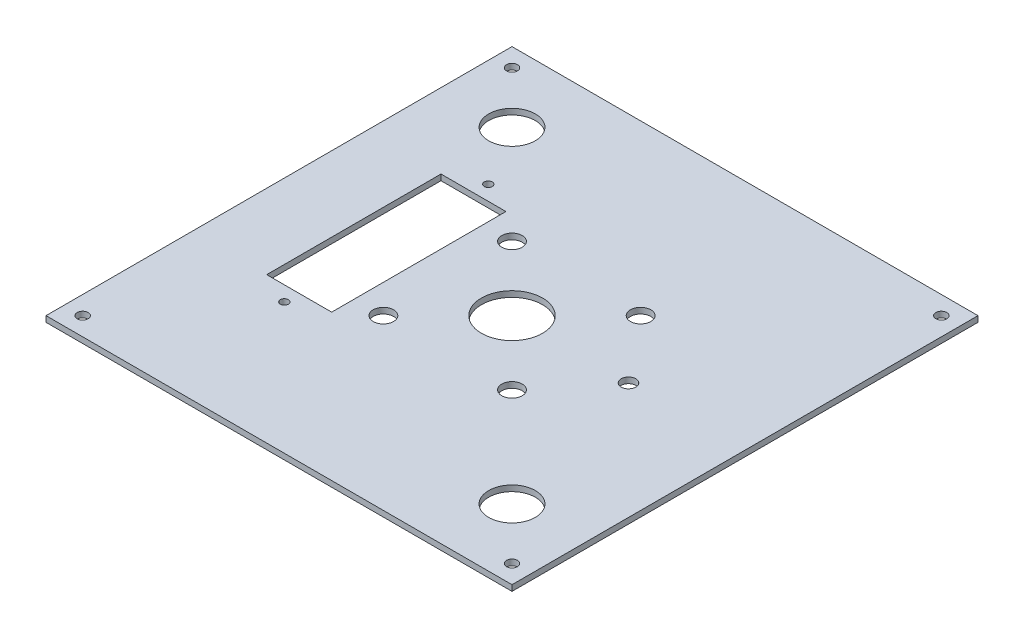
ISO-10303-21;
HEADER;
FILE_DESCRIPTION(('STEP AP214'),'2;1');
FILE_NAME('part.step','',(''),(''),'','','');
FILE_SCHEMA(('AUTOMOTIVE_DESIGN { 1 0 10303 214 1 1 1 1 }'));
ENDSEC;
DATA;
#1=APPLICATION_CONTEXT('core data for automotive mechanical design processes');
#2=APPLICATION_PROTOCOL_DEFINITION('international standard','automotive_design',2000,#1);
#3=PRODUCT_CONTEXT('',#1,'mechanical');
#4=PRODUCT('Part','Part','',(#3));
#5=PRODUCT_RELATED_PRODUCT_CATEGORY('part','',(#4));
#6=PRODUCT_DEFINITION_FORMATION('','',#4);
#7=PRODUCT_DEFINITION_CONTEXT('part definition',#1,'design');
#8=PRODUCT_DEFINITION('design','',#6,#7);
#9=PRODUCT_DEFINITION_SHAPE('','',#8);
#10=(LENGTH_UNIT() NAMED_UNIT(*) SI_UNIT(.MILLI.,.METRE.));
#11=(NAMED_UNIT(*) PLANE_ANGLE_UNIT() SI_UNIT($,.RADIAN.));
#12=(NAMED_UNIT(*) SI_UNIT($,.STERADIAN.) SOLID_ANGLE_UNIT());
#13=UNCERTAINTY_MEASURE_WITH_UNIT(LENGTH_MEASURE(1.E-05),#10,'distance_accuracy_value','');
#14=(GEOMETRIC_REPRESENTATION_CONTEXT(3) GLOBAL_UNCERTAINTY_ASSIGNED_CONTEXT((#13)) GLOBAL_UNIT_ASSIGNED_CONTEXT((#10,
#11,#12)) REPRESENTATION_CONTEXT('',''));
#15=CARTESIAN_POINT('',(0.,0.,0.));
#16=DIRECTION('',(0.,0.,1.));
#17=DIRECTION('',(1.,0.,0.));
#18=AXIS2_PLACEMENT_3D('',#15,#16,#17);
#19=CARTESIAN_POINT('',(0.,3.175,0.));
#20=DIRECTION('',(0.,-1.,0.));
#21=DIRECTION('',(0.,0.,-1.));
#22=AXIS2_PLACEMENT_3D('',#19,#20,#21);
#23=PLANE('',#22);
#24=CARTESIAN_POINT('',(63.5,3.175,0.));
#25=DIRECTION('',(0.,1.,0.));
#26=DIRECTION('',(0.,0.,1.));
#27=AXIS2_PLACEMENT_3D('',#24,#25,#26);
#28=CIRCLE('',#27,3.96874999999999);
#29=CARTESIAN_POINT('',(63.5,3.175,3.96874999999999));
#30=VERTEX_POINT('',#29);
#31=EDGE_CURVE('E246',#30,#30,#28,.T.);
#32=ORIENTED_EDGE('',*,*,#31,.F.);
#33=EDGE_LOOP('',(#32));
#34=FACE_BOUND('',#33,.T.);
#35=CARTESIAN_POINT('',(-68.5028439345944,3.175,-55.5625));
#36=DIRECTION('',(0.,1.,0.));
#37=DIRECTION('',(0.,0.,1.));
#38=AXIS2_PLACEMENT_3D('',#35,#36,#37);
#39=CIRCLE('',#38,2.1844);
#40=CARTESIAN_POINT('',(-68.5028439345944,3.175,-53.3781));
#41=VERTEX_POINT('',#40);
#42=EDGE_CURVE('E241',#41,#41,#39,.T.);
#43=ORIENTED_EDGE('',*,*,#42,.F.);
#44=EDGE_LOOP('',(#43));
#45=FACE_BOUND('',#44,.T.);
#46=CARTESIAN_POINT('',(-68.5028439345944,3.175,55.5625));
#47=DIRECTION('',(0.,1.,0.));
#48=DIRECTION('',(0.,0.,-1.));
#49=AXIS2_PLACEMENT_3D('',#46,#47,#48);
#50=CIRCLE('',#49,2.1844);
#51=CARTESIAN_POINT('',(-68.5028439345944,3.175,53.3781));
#52=VERTEX_POINT('',#51);
#53=EDGE_CURVE('E234',#52,#52,#50,.T.);
#54=ORIENTED_EDGE('',*,*,#53,.F.);
#55=EDGE_LOOP('',(#54));
#56=FACE_BOUND('',#55,.T.);
#57=CARTESIAN_POINT('',(0.,3.175,0.));
#58=DIRECTION('',(0.,1.,0.));
#59=DIRECTION('',(0.,0.,1.));
#60=AXIS2_PLACEMENT_3D('',#57,#58,#59);
#61=CIRCLE('',#60,16.66875);
#62=CARTESIAN_POINT('',(0.,3.175,16.66875));
#63=VERTEX_POINT('',#62);
#64=EDGE_CURVE('E230',#63,#63,#61,.T.);
#65=ORIENTED_EDGE('',*,*,#64,.F.);
#66=EDGE_LOOP('',(#65));
#67=FACE_BOUND('',#66,.T.);
#68=CARTESIAN_POINT('',(-88.9,3.175,-88.8999999999999));
#69=DIRECTION('',(0.,1.,0.));
#70=DIRECTION('',(0.,0.,1.));
#71=AXIS2_PLACEMENT_3D('',#68,#69,#70);
#72=CIRCLE('',#71,12.7);
#73=CARTESIAN_POINT('',(-88.9,3.175,-76.1999999999999));
#74=VERTEX_POINT('',#73);
#75=EDGE_CURVE('E225',#74,#74,#72,.T.);
#76=ORIENTED_EDGE('',*,*,#75,.F.);
#77=EDGE_LOOP('',(#76));
#78=FACE_BOUND('',#77,.T.);
#79=CARTESIAN_POINT('',(88.8999999999998,3.175,88.9));
#80=DIRECTION('',(0.,1.,0.));
#81=DIRECTION('',(0.,0.,-1.));
#82=AXIS2_PLACEMENT_3D('',#79,#80,#81);
#83=CIRCLE('',#82,12.7);
#84=CARTESIAN_POINT('',(88.8999999999998,3.175,76.2));
#85=VERTEX_POINT('',#84);
#86=EDGE_CURVE('E219',#85,#85,#83,.T.);
#87=ORIENTED_EDGE('',*,*,#86,.F.);
#88=EDGE_LOOP('',(#87));
#89=FACE_BOUND('',#88,.T.);
#90=CARTESIAN_POINT('',(-35.052,3.175,-35.052));
#91=DIRECTION('',(0.,1.,0.));
#92=DIRECTION('',(0.,0.,1.));
#93=AXIS2_PLACEMENT_3D('',#90,#91,#92);
#94=CIRCLE('',#93,5.55625);
#95=CARTESIAN_POINT('',(-35.052,3.175,-29.49575));
#96=VERTEX_POINT('',#95);
#97=EDGE_CURVE('E208',#96,#96,#94,.T.);
#98=ORIENTED_EDGE('',*,*,#97,.F.);
#99=EDGE_LOOP('',(#98));
#100=FACE_BOUND('',#99,.T.);
#101=CARTESIAN_POINT('',(35.0519999999998,3.175,35.0520000000002));
#102=DIRECTION('',(0.,1.,0.));
#103=DIRECTION('',(0.,0.,1.));
#104=AXIS2_PLACEMENT_3D('',#101,#102,#103);
#105=CIRCLE('',#104,5.55625);
#106=CARTESIAN_POINT('',(35.0519999999998,3.175,40.6082500000002));
#107=VERTEX_POINT('',#106);
#108=EDGE_CURVE('E201',#107,#107,#105,.T.);
#109=ORIENTED_EDGE('',*,*,#108,.F.);
#110=EDGE_LOOP('',(#109));
#111=FACE_BOUND('',#110,.T.);
#112=CARTESIAN_POINT('',(-35.052,3.175,35.052));
#113=DIRECTION('',(0.,1.,0.));
#114=DIRECTION('',(0.,0.,-1.));
#115=AXIS2_PLACEMENT_3D('',#112,#113,#114);
#116=CIRCLE('',#115,5.55625);
#117=CARTESIAN_POINT('',(-35.052,3.175,29.49575));
#118=VERTEX_POINT('',#117);
#119=EDGE_CURVE('E213',#118,#118,#116,.T.);
#120=ORIENTED_EDGE('',*,*,#119,.F.);
#121=EDGE_LOOP('',(#120));
#122=FACE_BOUND('',#121,.T.);
#123=CARTESIAN_POINT('',(35.0519999999998,3.175,-35.0520000000002));
#124=DIRECTION('',(0.,1.,0.));
#125=DIRECTION('',(0.,0.,-1.));
#126=AXIS2_PLACEMENT_3D('',#123,#124,#125);
#127=CIRCLE('',#126,5.55625);
#128=CARTESIAN_POINT('',(35.0519999999998,3.175,-40.6082500000002));
#129=VERTEX_POINT('',#128);
#130=EDGE_CURVE('E195',#129,#129,#127,.T.);
#131=ORIENTED_EDGE('',*,*,#130,.F.);
#132=EDGE_LOOP('',(#131));
#133=FACE_BOUND('',#132,.T.);
#134=CARTESIAN_POINT('',(-116.999999999993,3.175,117.));
#135=DIRECTION('',(0.,1.,0.));
#136=DIRECTION('',(0.,0.,1.));
#137=AXIS2_PLACEMENT_3D('',#134,#135,#136);
#138=CIRCLE('',#137,2.97688);
#139=CARTESIAN_POINT('',(-116.999999999993,3.175,119.97688));
#140=VERTEX_POINT('',#139);
#141=EDGE_CURVE('E177',#140,#140,#138,.T.);
#142=ORIENTED_EDGE('',*,*,#141,.F.);
#143=EDGE_LOOP('',(#142));
#144=FACE_BOUND('',#143,.T.);
#145=CARTESIAN_POINT('',(117.000000000007,3.175,116.999999999993));
#146=DIRECTION('',(0.,1.,0.));
#147=DIRECTION('',(0.,0.,1.));
#148=AXIS2_PLACEMENT_3D('',#145,#146,#147);
#149=CIRCLE('',#148,2.97688);
#150=CARTESIAN_POINT('',(117.000000000007,3.175,119.976879999993));
#151=VERTEX_POINT('',#150);
#152=EDGE_CURVE('E184',#151,#151,#149,.T.);
#153=ORIENTED_EDGE('',*,*,#152,.F.);
#154=EDGE_LOOP('',(#153));
#155=FACE_BOUND('',#154,.T.);
#156=CARTESIAN_POINT('',(117.,3.175,-117.000000000007));
#157=DIRECTION('',(0.,1.,0.));
#158=DIRECTION('',(0.,0.,1.));
#159=AXIS2_PLACEMENT_3D('',#156,#157,#158);
#160=CIRCLE('',#159,2.97688);
#161=CARTESIAN_POINT('',(117.,3.175,-114.023120000007));
#162=VERTEX_POINT('',#161);
#163=EDGE_CURVE('E190',#162,#162,#160,.T.);
#164=ORIENTED_EDGE('',*,*,#163,.F.);
#165=EDGE_LOOP('',(#164));
#166=FACE_BOUND('',#165,.T.);
#167=CARTESIAN_POINT('',(-117.,3.175,-117.));
#168=DIRECTION('',(0.,1.,0.));
#169=DIRECTION('',(0.,0.,1.));
#170=AXIS2_PLACEMENT_3D('',#167,#168,#169);
#171=CIRCLE('',#170,2.97688);
#172=CARTESIAN_POINT('',(-117.,3.175,-114.02312));
#173=VERTEX_POINT('',#172);
#174=EDGE_CURVE('E171',#173,#173,#171,.T.);
#175=ORIENTED_EDGE('',*,*,#174,.F.);
#176=EDGE_LOOP('',(#175));
#177=FACE_BOUND('',#176,.T.);
#178=DIRECTION('',(0.,0.,-1.));
#179=VECTOR('',#178,1.);
#180=CARTESIAN_POINT('',(127.,3.175,127.));
#181=LINE('',#180,#179);
#182=CARTESIAN_POINT('',(127.,3.175,127.));
#183=VERTEX_POINT('',#182);
#184=CARTESIAN_POINT('',(127.,3.175,-127.));
#185=VERTEX_POINT('',#184);
#186=EDGE_CURVE('E130',#183,#185,#181,.T.);
#187=ORIENTED_EDGE('',*,*,#186,.T.);
#188=DIRECTION('',(-1.,0.,0.));
#189=VECTOR('',#188,1.);
#190=CARTESIAN_POINT('',(-127.,3.175,-127.));
#191=LINE('',#190,#189);
#192=CARTESIAN_POINT('',(-127.,3.175,-127.));
#193=VERTEX_POINT('',#192);
#194=EDGE_CURVE('E133',#185,#193,#191,.T.);
#195=ORIENTED_EDGE('',*,*,#194,.T.);
#196=DIRECTION('',(0.,0.,1.));
#197=VECTOR('',#196,1.);
#198=CARTESIAN_POINT('',(-127.,3.175,127.));
#199=LINE('',#198,#197);
#200=CARTESIAN_POINT('',(-127.,3.175,127.));
#201=VERTEX_POINT('',#200);
#202=EDGE_CURVE('E136',#193,#201,#199,.T.);
#203=ORIENTED_EDGE('',*,*,#202,.T.);
#204=DIRECTION('',(1.,0.,0.));
#205=VECTOR('',#204,1.);
#206=CARTESIAN_POINT('',(-127.,3.175,127.));
#207=LINE('',#206,#205);
#208=EDGE_CURVE('E138',#201,#183,#207,.T.);
#209=ORIENTED_EDGE('',*,*,#208,.T.);
#210=EDGE_LOOP('',(#187,#195,#203,#209));
#211=FACE_BOUND('',#210,.T.);
#212=DIRECTION('',(-1.,0.,0.));
#213=VECTOR('',#212,1.);
#214=CARTESIAN_POINT('',(0.,3.175,47.4979999999999));
#215=LINE('',#214,#213);
#216=CARTESIAN_POINT('',(-50.8,3.175,47.498));
#217=VERTEX_POINT('',#216);
#218=CARTESIAN_POINT('',(-86.2056878691888,3.175,47.498));
#219=VERTEX_POINT('',#218);
#220=EDGE_CURVE('E53',#217,#219,#215,.T.);
#221=ORIENTED_EDGE('',*,*,#220,.T.);
#222=DIRECTION('',(0.,0.,1.));
#223=VECTOR('',#222,1.);
#224=CARTESIAN_POINT('',(-86.2056878691888,3.175,0.));
#225=LINE('',#224,#223);
#226=CARTESIAN_POINT('',(-86.2056878691888,3.175,-47.498));
#227=VERTEX_POINT('',#226);
#228=EDGE_CURVE('E120',#227,#219,#225,.T.);
#229=ORIENTED_EDGE('',*,*,#228,.F.);
#230=DIRECTION('',(-1.,0.,0.));
#231=VECTOR('',#230,1.);
#232=CARTESIAN_POINT('',(0.,3.175,-47.498));
#233=LINE('',#232,#231);
#234=CARTESIAN_POINT('',(-50.8,3.175,-47.498));
#235=VERTEX_POINT('',#234);
#236=EDGE_CURVE('E106',#235,#227,#233,.T.);
#237=ORIENTED_EDGE('',*,*,#236,.F.);
#238=DIRECTION('',(0.,0.,-1.));
#239=VECTOR('',#238,1.);
#240=CARTESIAN_POINT('',(-50.8,3.175,0.));
#241=LINE('',#240,#239);
#242=EDGE_CURVE('E115',#217,#235,#241,.T.);
#243=ORIENTED_EDGE('',*,*,#242,.F.);
#244=EDGE_LOOP('',(#221,#229,#237,#243));
#245=FACE_BOUND('',#244,.T.);
#246=ADVANCED_FACE('F37',(#34,#45,#56,#67,#78,#89,#100,#111,#122,#133,#144,#155,#166,#177,#211,
#245),#23,.F.);
#247=CARTESIAN_POINT('',(0.,0.,0.));
#248=DIRECTION('',(0.,-1.,0.));
#249=DIRECTION('',(0.,0.,-1.));
#250=AXIS2_PLACEMENT_3D('',#247,#248,#249);
#251=PLANE('',#250);
#252=CARTESIAN_POINT('',(63.5,0.,0.));
#253=DIRECTION('',(0.,1.,0.));
#254=DIRECTION('',(0.,0.,1.));
#255=AXIS2_PLACEMENT_3D('',#252,#253,#254);
#256=CIRCLE('',#255,3.96874999999999);
#257=CARTESIAN_POINT('',(63.5,0.,3.96874999999999));
#258=VERTEX_POINT('',#257);
#259=EDGE_CURVE('E238',#258,#258,#256,.T.);
#260=ORIENTED_EDGE('',*,*,#259,.T.);
#261=EDGE_LOOP('',(#260));
#262=FACE_BOUND('',#261,.T.);
#263=CARTESIAN_POINT('',(-68.5028439345944,0.,-55.5625));
#264=DIRECTION('',(0.,1.,0.));
#265=DIRECTION('',(0.,0.,1.));
#266=AXIS2_PLACEMENT_3D('',#263,#264,#265);
#267=CIRCLE('',#266,2.1844);
#268=CARTESIAN_POINT('',(-68.5028439345944,0.,-53.3781));
#269=VERTEX_POINT('',#268);
#270=EDGE_CURVE('E233',#269,#269,#267,.T.);
#271=ORIENTED_EDGE('',*,*,#270,.T.);
#272=EDGE_LOOP('',(#271));
#273=FACE_BOUND('',#272,.T.);
#274=CARTESIAN_POINT('',(-68.5028439345944,0.,55.5625));
#275=DIRECTION('',(0.,1.,0.));
#276=DIRECTION('',(0.,0.,-1.));
#277=AXIS2_PLACEMENT_3D('',#274,#275,#276);
#278=CIRCLE('',#277,2.1844);
#279=CARTESIAN_POINT('',(-68.5028439345944,0.,53.3781));
#280=VERTEX_POINT('',#279);
#281=EDGE_CURVE('E237',#280,#280,#278,.T.);
#282=ORIENTED_EDGE('',*,*,#281,.T.);
#283=EDGE_LOOP('',(#282));
#284=FACE_BOUND('',#283,.T.);
#285=CARTESIAN_POINT('',(0.,0.,0.));
#286=DIRECTION('',(0.,-1.,0.));
#287=DIRECTION('',(0.,0.,-1.));
#288=AXIS2_PLACEMENT_3D('',#285,#286,#287);
#289=CIRCLE('',#288,16.66875);
#290=CARTESIAN_POINT('',(0.,0.,-16.66875));
#291=VERTEX_POINT('',#290);
#292=EDGE_CURVE('E41',#291,#291,#289,.T.);
#293=ORIENTED_EDGE('',*,*,#292,.F.);
#294=EDGE_LOOP('',(#293));
#295=FACE_BOUND('',#294,.T.);
#296=CARTESIAN_POINT('',(-88.9,0.,-88.8999999999999));
#297=DIRECTION('',(0.,1.,0.));
#298=DIRECTION('',(0.,0.,1.));
#299=AXIS2_PLACEMENT_3D('',#296,#297,#298);
#300=CIRCLE('',#299,12.7);
#301=CARTESIAN_POINT('',(-88.9,0.,-76.1999999999999));
#302=VERTEX_POINT('',#301);
#303=EDGE_CURVE('E216',#302,#302,#300,.T.);
#304=ORIENTED_EDGE('',*,*,#303,.T.);
#305=EDGE_LOOP('',(#304));
#306=FACE_BOUND('',#305,.T.);
#307=CARTESIAN_POINT('',(88.8999999999998,0.,88.9));
#308=DIRECTION('',(0.,1.,0.));
#309=DIRECTION('',(0.,0.,-1.));
#310=AXIS2_PLACEMENT_3D('',#307,#308,#309);
#311=CIRCLE('',#310,12.7);
#312=CARTESIAN_POINT('',(88.8999999999998,0.,76.2));
#313=VERTEX_POINT('',#312);
#314=EDGE_CURVE('E222',#313,#313,#311,.T.);
#315=ORIENTED_EDGE('',*,*,#314,.T.);
#316=EDGE_LOOP('',(#315));
#317=FACE_BOUND('',#316,.T.);
#318=CARTESIAN_POINT('',(-35.052,0.,-35.052));
#319=DIRECTION('',(0.,1.,0.));
#320=DIRECTION('',(0.,0.,1.));
#321=AXIS2_PLACEMENT_3D('',#318,#319,#320);
#322=CIRCLE('',#321,5.55625);
#323=CARTESIAN_POINT('',(-35.052,0.,-29.49575));
#324=VERTEX_POINT('',#323);
#325=EDGE_CURVE('E198',#324,#324,#322,.T.);
#326=ORIENTED_EDGE('',*,*,#325,.T.);
#327=EDGE_LOOP('',(#326));
#328=FACE_BOUND('',#327,.T.);
#329=CARTESIAN_POINT('',(35.0519999999998,0.,35.0520000000002));
#330=DIRECTION('',(0.,1.,0.));
#331=DIRECTION('',(0.,0.,1.));
#332=AXIS2_PLACEMENT_3D('',#329,#330,#331);
#333=CIRCLE('',#332,5.55625);
#334=CARTESIAN_POINT('',(35.0519999999998,0.,40.6082500000002));
#335=VERTEX_POINT('',#334);
#336=EDGE_CURVE('E204',#335,#335,#333,.T.);
#337=ORIENTED_EDGE('',*,*,#336,.T.);
#338=EDGE_LOOP('',(#337));
#339=FACE_BOUND('',#338,.T.);
#340=CARTESIAN_POINT('',(-35.052,0.,35.052));
#341=DIRECTION('',(0.,1.,0.));
#342=DIRECTION('',(0.,0.,-1.));
#343=AXIS2_PLACEMENT_3D('',#340,#341,#342);
#344=CIRCLE('',#343,5.55625);
#345=CARTESIAN_POINT('',(-35.052,0.,29.49575));
#346=VERTEX_POINT('',#345);
#347=EDGE_CURVE('E205',#346,#346,#344,.T.);
#348=ORIENTED_EDGE('',*,*,#347,.T.);
#349=EDGE_LOOP('',(#348));
#350=FACE_BOUND('',#349,.T.);
#351=CARTESIAN_POINT('',(35.0519999999998,0.,-35.0520000000002));
#352=DIRECTION('',(0.,1.,0.));
#353=DIRECTION('',(0.,0.,-1.));
#354=AXIS2_PLACEMENT_3D('',#351,#352,#353);
#355=CIRCLE('',#354,5.55625);
#356=CARTESIAN_POINT('',(35.0519999999998,0.,-40.6082500000002));
#357=VERTEX_POINT('',#356);
#358=EDGE_CURVE('E181',#357,#357,#355,.T.);
#359=ORIENTED_EDGE('',*,*,#358,.T.);
#360=EDGE_LOOP('',(#359));
#361=FACE_BOUND('',#360,.T.);
#362=CARTESIAN_POINT('',(-116.999999999993,0.,117.));
#363=DIRECTION('',(0.,1.,0.));
#364=DIRECTION('',(0.,0.,1.));
#365=AXIS2_PLACEMENT_3D('',#362,#363,#364);
#366=CIRCLE('',#365,2.97688);
#367=CARTESIAN_POINT('',(-116.999999999993,0.,119.97688));
#368=VERTEX_POINT('',#367);
#369=EDGE_CURVE('E180',#368,#368,#366,.T.);
#370=ORIENTED_EDGE('',*,*,#369,.T.);
#371=EDGE_LOOP('',(#370));
#372=FACE_BOUND('',#371,.T.);
#373=CARTESIAN_POINT('',(117.000000000007,0.,116.999999999993));
#374=DIRECTION('',(0.,1.,0.));
#375=DIRECTION('',(0.,0.,1.));
#376=AXIS2_PLACEMENT_3D('',#373,#374,#375);
#377=CIRCLE('',#376,2.97688);
#378=CARTESIAN_POINT('',(117.000000000007,0.,119.976879999993));
#379=VERTEX_POINT('',#378);
#380=EDGE_CURVE('E187',#379,#379,#377,.T.);
#381=ORIENTED_EDGE('',*,*,#380,.T.);
#382=EDGE_LOOP('',(#381));
#383=FACE_BOUND('',#382,.T.);
#384=CARTESIAN_POINT('',(117.,0.,-117.000000000007));
#385=DIRECTION('',(0.,1.,0.));
#386=DIRECTION('',(0.,0.,1.));
#387=AXIS2_PLACEMENT_3D('',#384,#385,#386);
#388=CIRCLE('',#387,2.97688);
#389=CARTESIAN_POINT('',(117.,0.,-114.023120000007));
#390=VERTEX_POINT('',#389);
#391=EDGE_CURVE('E175',#390,#390,#388,.T.);
#392=ORIENTED_EDGE('',*,*,#391,.T.);
#393=EDGE_LOOP('',(#392));
#394=FACE_BOUND('',#393,.T.);
#395=CARTESIAN_POINT('',(-117.,0.,-117.));
#396=DIRECTION('',(0.,1.,0.));
#397=DIRECTION('',(0.,0.,1.));
#398=AXIS2_PLACEMENT_3D('',#395,#396,#397);
#399=CIRCLE('',#398,2.97688);
#400=CARTESIAN_POINT('',(-117.,0.,-114.02312));
#401=VERTEX_POINT('',#400);
#402=EDGE_CURVE('E169',#401,#401,#399,.T.);
#403=ORIENTED_EDGE('',*,*,#402,.T.);
#404=EDGE_LOOP('',(#403));
#405=FACE_BOUND('',#404,.T.);
#406=DIRECTION('',(0.,0.,-1.));
#407=VECTOR('',#406,1.);
#408=CARTESIAN_POINT('',(127.,0.,127.));
#409=LINE('',#408,#407);
#410=CARTESIAN_POINT('',(127.,0.,127.));
#411=VERTEX_POINT('',#410);
#412=CARTESIAN_POINT('',(127.,0.,-127.));
#413=VERTEX_POINT('',#412);
#414=EDGE_CURVE('E127',#411,#413,#409,.T.);
#415=ORIENTED_EDGE('',*,*,#414,.F.);
#416=DIRECTION('',(1.,0.,0.));
#417=VECTOR('',#416,1.);
#418=CARTESIAN_POINT('',(-127.,0.,127.));
#419=LINE('',#418,#417);
#420=CARTESIAN_POINT('',(-127.,0.,127.));
#421=VERTEX_POINT('',#420);
#422=EDGE_CURVE('E134',#421,#411,#419,.T.);
#423=ORIENTED_EDGE('',*,*,#422,.F.);
#424=DIRECTION('',(0.,0.,1.));
#425=VECTOR('',#424,1.);
#426=CARTESIAN_POINT('',(-127.,0.,127.));
#427=LINE('',#426,#425);
#428=CARTESIAN_POINT('',(-127.,0.,-127.));
#429=VERTEX_POINT('',#428);
#430=EDGE_CURVE('E145',#429,#421,#427,.T.);
#431=ORIENTED_EDGE('',*,*,#430,.F.);
#432=DIRECTION('',(-1.,0.,0.));
#433=VECTOR('',#432,1.);
#434=CARTESIAN_POINT('',(-127.,0.,-127.));
#435=LINE('',#434,#433);
#436=EDGE_CURVE('E143',#413,#429,#435,.T.);
#437=ORIENTED_EDGE('',*,*,#436,.F.);
#438=EDGE_LOOP('',(#415,#423,#431,#437));
#439=FACE_BOUND('',#438,.T.);
#440=DIRECTION('',(0.,0.,-1.));
#441=VECTOR('',#440,1.);
#442=CARTESIAN_POINT('',(-86.2056878691888,0.,0.));
#443=LINE('',#442,#441);
#444=CARTESIAN_POINT('',(-86.2056878691888,0.,47.498));
#445=VERTEX_POINT('',#444);
#446=CARTESIAN_POINT('',(-86.2056878691888,0.,-47.498));
#447=VERTEX_POINT('',#446);
#448=EDGE_CURVE('E46',#445,#447,#443,.T.);
#449=ORIENTED_EDGE('',*,*,#448,.F.);
#450=DIRECTION('',(1.,0.,0.));
#451=VECTOR('',#450,1.);
#452=CARTESIAN_POINT('',(0.,0.,47.4979999999999));
#453=LINE('',#452,#451);
#454=CARTESIAN_POINT('',(-50.8,0.,47.498));
#455=VERTEX_POINT('',#454);
#456=EDGE_CURVE('E11',#445,#455,#453,.T.);
#457=ORIENTED_EDGE('',*,*,#456,.T.);
#458=DIRECTION('',(0.,0.,1.));
#459=VECTOR('',#458,1.);
#460=CARTESIAN_POINT('',(-50.8,0.,0.));
#461=LINE('',#460,#459);
#462=CARTESIAN_POINT('',(-50.8,0.,-47.498));
#463=VERTEX_POINT('',#462);
#464=EDGE_CURVE('E159',#463,#455,#461,.T.);
#465=ORIENTED_EDGE('',*,*,#464,.F.);
#466=DIRECTION('',(1.,0.,0.));
#467=VECTOR('',#466,1.);
#468=CARTESIAN_POINT('',(0.,0.,-47.498));
#469=LINE('',#468,#467);
#470=EDGE_CURVE('E109',#447,#463,#469,.T.);
#471=ORIENTED_EDGE('',*,*,#470,.F.);
#472=EDGE_LOOP('',(#449,#457,#465,#471));
#473=FACE_BOUND('',#472,.T.);
#474=ADVANCED_FACE('F167',(#262,#273,#284,#295,#306,#317,#328,#339,#350,#361,#372,#383,#394,
#405,#439,#473),#251,.T.);
#475=CARTESIAN_POINT('',(127.,3.175,127.));
#476=DIRECTION('',(-1.,0.,0.));
#477=DIRECTION('',(0.,0.,1.));
#478=AXIS2_PLACEMENT_3D('',#475,#476,#477);
#479=PLANE('',#478);
#480=ORIENTED_EDGE('',*,*,#414,.T.);
#481=DIRECTION('',(0.,-1.,0.));
#482=VECTOR('',#481,1.);
#483=CARTESIAN_POINT('',(127.,3.175,-127.));
#484=LINE('',#483,#482);
#485=EDGE_CURVE('E156',#185,#413,#484,.T.);
#486=ORIENTED_EDGE('',*,*,#485,.F.);
#487=ORIENTED_EDGE('',*,*,#186,.F.);
#488=DIRECTION('',(0.,-1.,0.));
#489=VECTOR('',#488,1.);
#490=CARTESIAN_POINT('',(127.,3.175,127.));
#491=LINE('',#490,#489);
#492=EDGE_CURVE('E140',#183,#411,#491,.T.);
#493=ORIENTED_EDGE('',*,*,#492,.T.);
#494=EDGE_LOOP('',(#480,#486,#487,#493));
#495=FACE_BOUND('',#494,.T.);
#496=ADVANCED_FACE('F39',(#495),#479,.F.);
#497=CARTESIAN_POINT('',(-127.,3.175,-127.));
#498=DIRECTION('',(0.,0.,1.));
#499=DIRECTION('',(1.,0.,0.));
#500=AXIS2_PLACEMENT_3D('',#497,#498,#499);
#501=PLANE('',#500);
#502=ORIENTED_EDGE('',*,*,#436,.T.);
#503=DIRECTION('',(0.,-1.,0.));
#504=VECTOR('',#503,1.);
#505=CARTESIAN_POINT('',(-127.,3.175,-127.));
#506=LINE('',#505,#504);
#507=EDGE_CURVE('E153',#193,#429,#506,.T.);
#508=ORIENTED_EDGE('',*,*,#507,.F.);
#509=ORIENTED_EDGE('',*,*,#194,.F.);
#510=ORIENTED_EDGE('',*,*,#485,.T.);
#511=EDGE_LOOP('',(#502,#508,#509,#510));
#512=FACE_BOUND('',#511,.T.);
#513=ADVANCED_FACE('F298',(#512),#501,.F.);
#514=CARTESIAN_POINT('',(-127.,3.175,127.));
#515=DIRECTION('',(1.,0.,0.));
#516=DIRECTION('',(0.,0.,-1.));
#517=AXIS2_PLACEMENT_3D('',#514,#515,#516);
#518=PLANE('',#517);
#519=ORIENTED_EDGE('',*,*,#430,.T.);
#520=DIRECTION('',(0.,-1.,0.));
#521=VECTOR('',#520,1.);
#522=CARTESIAN_POINT('',(-127.,3.175,127.));
#523=LINE('',#522,#521);
#524=EDGE_CURVE('E150',#201,#421,#523,.T.);
#525=ORIENTED_EDGE('',*,*,#524,.F.);
#526=ORIENTED_EDGE('',*,*,#202,.F.);
#527=ORIENTED_EDGE('',*,*,#507,.T.);
#528=EDGE_LOOP('',(#519,#525,#526,#527));
#529=FACE_BOUND('',#528,.T.);
#530=ADVANCED_FACE('F303',(#529),#518,.F.);
#531=CARTESIAN_POINT('',(-127.,3.175,127.));
#532=DIRECTION('',(0.,0.,-1.));
#533=DIRECTION('',(-1.,0.,0.));
#534=AXIS2_PLACEMENT_3D('',#531,#532,#533);
#535=PLANE('',#534);
#536=ORIENTED_EDGE('',*,*,#422,.T.);
#537=ORIENTED_EDGE('',*,*,#492,.F.);
#538=ORIENTED_EDGE('',*,*,#208,.F.);
#539=ORIENTED_EDGE('',*,*,#524,.T.);
#540=EDGE_LOOP('',(#536,#537,#538,#539));
#541=FACE_BOUND('',#540,.T.);
#542=ADVANCED_FACE('F306',(#541),#535,.F.);
#543=CARTESIAN_POINT('',(0.,-22.225,47.4979999999999));
#544=DIRECTION('',(0.,0.,-1.));
#545=DIRECTION('',(-1.,0.,0.));
#546=AXIS2_PLACEMENT_3D('',#543,#544,#545);
#547=PLANE('',#546);
#548=DIRECTION('',(0.,1.,0.));
#549=VECTOR('',#548,1.);
#550=CARTESIAN_POINT('',(-86.2056878691888,-22.225,47.498));
#551=LINE('',#550,#549);
#552=EDGE_CURVE('E125',#445,#219,#551,.T.);
#553=ORIENTED_EDGE('',*,*,#552,.T.);
#554=ORIENTED_EDGE('',*,*,#220,.F.);
#555=DIRECTION('',(0.,1.,0.));
#556=VECTOR('',#555,1.);
#557=CARTESIAN_POINT('',(-50.8,-22.225,47.498));
#558=LINE('',#557,#556);
#559=EDGE_CURVE('E112',#455,#217,#558,.T.);
#560=ORIENTED_EDGE('',*,*,#559,.F.);
#561=ORIENTED_EDGE('',*,*,#456,.F.);
#562=EDGE_LOOP('',(#553,#554,#560,#561));
#563=FACE_BOUND('',#562,.T.);
#564=ADVANCED_FACE('F168',(#563),#547,.T.);
#565=CARTESIAN_POINT('',(-86.2056878691888,-22.225,0.));
#566=DIRECTION('',(-1.,0.,0.));
#567=DIRECTION('',(0.,0.,1.));
#568=AXIS2_PLACEMENT_3D('',#565,#566,#567);
#569=PLANE('',#568);
#570=ORIENTED_EDGE('',*,*,#448,.T.);
#571=DIRECTION('',(0.,1.,0.));
#572=VECTOR('',#571,1.);
#573=CARTESIAN_POINT('',(-86.2056878691888,-22.225,-47.498));
#574=LINE('',#573,#572);
#575=EDGE_CURVE('E111',#447,#227,#574,.T.);
#576=ORIENTED_EDGE('',*,*,#575,.T.);
#577=ORIENTED_EDGE('',*,*,#228,.T.);
#578=ORIENTED_EDGE('',*,*,#552,.F.);
#579=EDGE_LOOP('',(#570,#576,#577,#578));
#580=FACE_BOUND('',#579,.T.);
#581=ADVANCED_FACE('F165',(#580),#569,.F.);
#582=CARTESIAN_POINT('',(0.,-22.225,-47.498));
#583=DIRECTION('',(0.,0.,-1.));
#584=DIRECTION('',(-1.,0.,0.));
#585=AXIS2_PLACEMENT_3D('',#582,#583,#584);
#586=PLANE('',#585);
#587=ORIENTED_EDGE('',*,*,#470,.T.);
#588=DIRECTION('',(0.,1.,0.));
#589=VECTOR('',#588,1.);
#590=CARTESIAN_POINT('',(-50.8,-22.225,-47.498));
#591=LINE('',#590,#589);
#592=EDGE_CURVE('E61',#463,#235,#591,.T.);
#593=ORIENTED_EDGE('',*,*,#592,.T.);
#594=ORIENTED_EDGE('',*,*,#236,.T.);
#595=ORIENTED_EDGE('',*,*,#575,.F.);
#596=EDGE_LOOP('',(#587,#593,#594,#595));
#597=FACE_BOUND('',#596,.T.);
#598=ADVANCED_FACE('F103',(#597),#586,.F.);
#599=CARTESIAN_POINT('',(-50.8,-22.225,0.));
#600=DIRECTION('',(1.,0.,0.));
#601=DIRECTION('',(0.,0.,-1.));
#602=AXIS2_PLACEMENT_3D('',#599,#600,#601);
#603=PLANE('',#602);
#604=ORIENTED_EDGE('',*,*,#464,.T.);
#605=ORIENTED_EDGE('',*,*,#559,.T.);
#606=ORIENTED_EDGE('',*,*,#242,.T.);
#607=ORIENTED_EDGE('',*,*,#592,.F.);
#608=EDGE_LOOP('',(#604,#605,#606,#607));
#609=FACE_BOUND('',#608,.T.);
#610=ADVANCED_FACE('F116',(#609),#603,.F.);
#611=CARTESIAN_POINT('',(-117.,0.,-117.));
#612=DIRECTION('',(0.,1.,0.));
#613=DIRECTION('',(0.,0.,1.));
#614=AXIS2_PLACEMENT_3D('',#611,#612,#613);
#615=CYLINDRICAL_SURFACE('',#614,2.97688);
#616=ORIENTED_EDGE('',*,*,#402,.F.);
#617=EDGE_LOOP('',(#616));
#618=FACE_BOUND('',#617,.T.);
#619=ORIENTED_EDGE('',*,*,#174,.T.);
#620=EDGE_LOOP('',(#619));
#621=FACE_BOUND('',#620,.T.);
#622=ADVANCED_FACE('F354',(#618,#621),#615,.F.);
#623=CARTESIAN_POINT('',(117.,0.,-117.000000000007));
#624=DIRECTION('',(0.,1.,0.));
#625=DIRECTION('',(0.,0.,1.));
#626=AXIS2_PLACEMENT_3D('',#623,#624,#625);
#627=CYLINDRICAL_SURFACE('',#626,2.97688);
#628=ORIENTED_EDGE('',*,*,#391,.F.);
#629=EDGE_LOOP('',(#628));
#630=FACE_BOUND('',#629,.T.);
#631=ORIENTED_EDGE('',*,*,#163,.T.);
#632=EDGE_LOOP('',(#631));
#633=FACE_BOUND('',#632,.T.);
#634=ADVANCED_FACE('F361',(#630,#633),#627,.F.);
#635=CARTESIAN_POINT('',(117.000000000007,0.,116.999999999993));
#636=DIRECTION('',(0.,1.,0.));
#637=DIRECTION('',(0.,0.,1.));
#638=AXIS2_PLACEMENT_3D('',#635,#636,#637);
#639=CYLINDRICAL_SURFACE('',#638,2.97688);
#640=ORIENTED_EDGE('',*,*,#380,.F.);
#641=EDGE_LOOP('',(#640));
#642=FACE_BOUND('',#641,.T.);
#643=ORIENTED_EDGE('',*,*,#152,.T.);
#644=EDGE_LOOP('',(#643));
#645=FACE_BOUND('',#644,.T.);
#646=ADVANCED_FACE('F369',(#642,#645),#639,.F.);
#647=CARTESIAN_POINT('',(-116.999999999993,0.,117.));
#648=DIRECTION('',(0.,1.,0.));
#649=DIRECTION('',(0.,0.,1.));
#650=AXIS2_PLACEMENT_3D('',#647,#648,#649);
#651=CYLINDRICAL_SURFACE('',#650,2.97688);
#652=ORIENTED_EDGE('',*,*,#369,.F.);
#653=EDGE_LOOP('',(#652));
#654=FACE_BOUND('',#653,.T.);
#655=ORIENTED_EDGE('',*,*,#141,.T.);
#656=EDGE_LOOP('',(#655));
#657=FACE_BOUND('',#656,.T.);
#658=ADVANCED_FACE('F377',(#654,#657),#651,.F.);
#659=CARTESIAN_POINT('',(35.0519999999998,0.,-35.0520000000002));
#660=DIRECTION('',(0.,1.,0.));
#661=DIRECTION('',(0.,0.,1.));
#662=AXIS2_PLACEMENT_3D('',#659,#660,#661);
#663=CYLINDRICAL_SURFACE('',#662,5.55625);
#664=ORIENTED_EDGE('',*,*,#358,.F.);
#665=EDGE_LOOP('',(#664));
#666=FACE_BOUND('',#665,.T.);
#667=ORIENTED_EDGE('',*,*,#130,.T.);
#668=EDGE_LOOP('',(#667));
#669=FACE_BOUND('',#668,.T.);
#670=ADVANCED_FACE('F385',(#666,#669),#663,.F.);
#671=CARTESIAN_POINT('',(-35.052,0.,35.052));
#672=DIRECTION('',(0.,1.,0.));
#673=DIRECTION('',(0.,0.,1.));
#674=AXIS2_PLACEMENT_3D('',#671,#672,#673);
#675=CYLINDRICAL_SURFACE('',#674,5.55625);
#676=ORIENTED_EDGE('',*,*,#347,.F.);
#677=EDGE_LOOP('',(#676));
#678=FACE_BOUND('',#677,.T.);
#679=ORIENTED_EDGE('',*,*,#119,.T.);
#680=EDGE_LOOP('',(#679));
#681=FACE_BOUND('',#680,.T.);
#682=ADVANCED_FACE('F393',(#678,#681),#675,.F.);
#683=CARTESIAN_POINT('',(35.0519999999998,0.,35.0520000000002));
#684=DIRECTION('',(0.,1.,0.));
#685=DIRECTION('',(0.,0.,1.));
#686=AXIS2_PLACEMENT_3D('',#683,#684,#685);
#687=CYLINDRICAL_SURFACE('',#686,5.55625);
#688=ORIENTED_EDGE('',*,*,#336,.F.);
#689=EDGE_LOOP('',(#688));
#690=FACE_BOUND('',#689,.T.);
#691=ORIENTED_EDGE('',*,*,#108,.T.);
#692=EDGE_LOOP('',(#691));
#693=FACE_BOUND('',#692,.T.);
#694=ADVANCED_FACE('F401',(#690,#693),#687,.F.);
#695=CARTESIAN_POINT('',(-35.052,0.,-35.052));
#696=DIRECTION('',(0.,1.,0.));
#697=DIRECTION('',(0.,0.,1.));
#698=AXIS2_PLACEMENT_3D('',#695,#696,#697);
#699=CYLINDRICAL_SURFACE('',#698,5.55625);
#700=ORIENTED_EDGE('',*,*,#325,.F.);
#701=EDGE_LOOP('',(#700));
#702=FACE_BOUND('',#701,.T.);
#703=ORIENTED_EDGE('',*,*,#97,.T.);
#704=EDGE_LOOP('',(#703));
#705=FACE_BOUND('',#704,.T.);
#706=ADVANCED_FACE('F409',(#702,#705),#699,.F.);
#707=CARTESIAN_POINT('',(88.8999999999998,0.,88.9));
#708=DIRECTION('',(0.,1.,0.));
#709=DIRECTION('',(0.,0.,1.));
#710=AXIS2_PLACEMENT_3D('',#707,#708,#709);
#711=CYLINDRICAL_SURFACE('',#710,12.7);
#712=ORIENTED_EDGE('',*,*,#314,.F.);
#713=EDGE_LOOP('',(#712));
#714=FACE_BOUND('',#713,.T.);
#715=ORIENTED_EDGE('',*,*,#86,.T.);
#716=EDGE_LOOP('',(#715));
#717=FACE_BOUND('',#716,.T.);
#718=ADVANCED_FACE('F417',(#714,#717),#711,.F.);
#719=CARTESIAN_POINT('',(-88.9,0.,-88.8999999999999));
#720=DIRECTION('',(0.,1.,0.));
#721=DIRECTION('',(0.,0.,1.));
#722=AXIS2_PLACEMENT_3D('',#719,#720,#721);
#723=CYLINDRICAL_SURFACE('',#722,12.7);
#724=ORIENTED_EDGE('',*,*,#303,.F.);
#725=EDGE_LOOP('',(#724));
#726=FACE_BOUND('',#725,.T.);
#727=ORIENTED_EDGE('',*,*,#75,.T.);
#728=EDGE_LOOP('',(#727));
#729=FACE_BOUND('',#728,.T.);
#730=ADVANCED_FACE('F425',(#726,#729),#723,.F.);
#731=CARTESIAN_POINT('',(0.,-504.825,0.));
#732=DIRECTION('',(0.,1.,0.));
#733=DIRECTION('',(0.,0.,1.));
#734=AXIS2_PLACEMENT_3D('',#731,#732,#733);
#735=CYLINDRICAL_SURFACE('',#734,16.66875);
#736=ORIENTED_EDGE('',*,*,#292,.T.);
#737=EDGE_LOOP('',(#736));
#738=FACE_BOUND('',#737,.T.);
#739=ORIENTED_EDGE('',*,*,#64,.T.);
#740=EDGE_LOOP('',(#739));
#741=FACE_BOUND('',#740,.T.);
#742=ADVANCED_FACE('F433',(#738,#741),#735,.F.);
#743=CARTESIAN_POINT('',(-68.5028439345944,0.,55.5625));
#744=DIRECTION('',(0.,1.,0.));
#745=DIRECTION('',(0.,0.,1.));
#746=AXIS2_PLACEMENT_3D('',#743,#744,#745);
#747=CYLINDRICAL_SURFACE('',#746,2.1844);
#748=ORIENTED_EDGE('',*,*,#281,.F.);
#749=EDGE_LOOP('',(#748));
#750=FACE_BOUND('',#749,.T.);
#751=ORIENTED_EDGE('',*,*,#53,.T.);
#752=EDGE_LOOP('',(#751));
#753=FACE_BOUND('',#752,.T.);
#754=ADVANCED_FACE('F441',(#750,#753),#747,.F.);
#755=CARTESIAN_POINT('',(-68.5028439345944,0.,-55.5625));
#756=DIRECTION('',(0.,1.,0.));
#757=DIRECTION('',(0.,0.,1.));
#758=AXIS2_PLACEMENT_3D('',#755,#756,#757);
#759=CYLINDRICAL_SURFACE('',#758,2.1844);
#760=ORIENTED_EDGE('',*,*,#270,.F.);
#761=EDGE_LOOP('',(#760));
#762=FACE_BOUND('',#761,.T.);
#763=ORIENTED_EDGE('',*,*,#42,.T.);
#764=EDGE_LOOP('',(#763));
#765=FACE_BOUND('',#764,.T.);
#766=ADVANCED_FACE('F257',(#762,#765),#759,.F.);
#767=CARTESIAN_POINT('',(63.5,0.,0.));
#768=DIRECTION('',(0.,1.,0.));
#769=DIRECTION('',(0.,0.,1.));
#770=AXIS2_PLACEMENT_3D('',#767,#768,#769);
#771=CYLINDRICAL_SURFACE('',#770,3.96874999999999);
#772=ORIENTED_EDGE('',*,*,#259,.F.);
#773=EDGE_LOOP('',(#772));
#774=FACE_BOUND('',#773,.T.);
#775=ORIENTED_EDGE('',*,*,#31,.T.);
#776=EDGE_LOOP('',(#775));
#777=FACE_BOUND('',#776,.T.);
#778=ADVANCED_FACE('F254',(#774,#777),#771,.F.);
#779=CLOSED_SHELL('',(#246,#474,#496,#513,#530,#542,#564,#581,#598,#610,#622,#634,#646,#658,
#670,#682,#694,#706,#718,#730,#742,#754,#766,#778));
#780=MANIFOLD_SOLID_BREP('B2',#779);
#781=ADVANCED_BREP_SHAPE_REPRESENTATION('',(#18,#780),#14);
#782=SHAPE_DEFINITION_REPRESENTATION(#9,#781);
ENDSEC;
END-ISO-10303-21;
